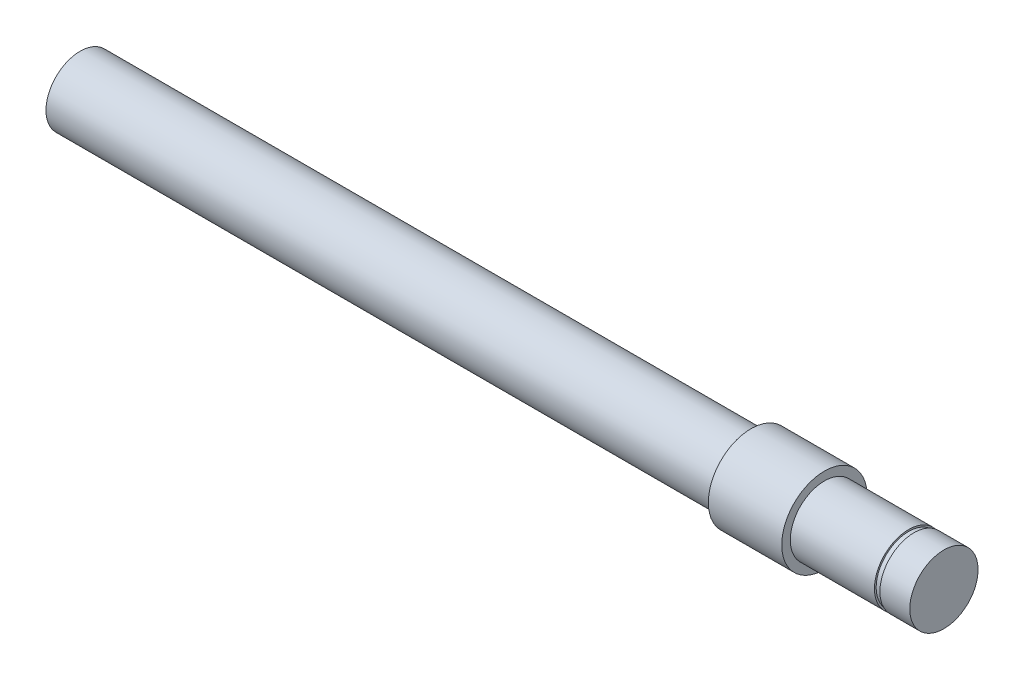
ISO-10303-21;
HEADER;
FILE_DESCRIPTION(('STEP AP214'),'2;1');
FILE_NAME('part.step','',(''),(''),'','','');
FILE_SCHEMA(('AUTOMOTIVE_DESIGN { 1 0 10303 214 1 1 1 1 }'));
ENDSEC;
DATA;
#1=APPLICATION_CONTEXT('core data for automotive mechanical design processes');
#2=APPLICATION_PROTOCOL_DEFINITION('international standard','automotive_design',2000,#1);
#3=PRODUCT_CONTEXT('',#1,'mechanical');
#4=PRODUCT('Part','Part','',(#3));
#5=PRODUCT_RELATED_PRODUCT_CATEGORY('part','',(#4));
#6=PRODUCT_DEFINITION_FORMATION('','',#4);
#7=PRODUCT_DEFINITION_CONTEXT('part definition',#1,'design');
#8=PRODUCT_DEFINITION('design','',#6,#7);
#9=PRODUCT_DEFINITION_SHAPE('','',#8);
#10=(LENGTH_UNIT() NAMED_UNIT(*) SI_UNIT(.MILLI.,.METRE.));
#11=(NAMED_UNIT(*) PLANE_ANGLE_UNIT() SI_UNIT($,.RADIAN.));
#12=(NAMED_UNIT(*) SI_UNIT($,.STERADIAN.) SOLID_ANGLE_UNIT());
#13=UNCERTAINTY_MEASURE_WITH_UNIT(LENGTH_MEASURE(1.E-05),#10,'distance_accuracy_value','');
#14=(GEOMETRIC_REPRESENTATION_CONTEXT(3) GLOBAL_UNCERTAINTY_ASSIGNED_CONTEXT((#13)) GLOBAL_UNIT_ASSIGNED_CONTEXT((#10,
#11,#12)) REPRESENTATION_CONTEXT('',''));
#15=CARTESIAN_POINT('',(0.,0.,0.));
#16=DIRECTION('',(0.,0.,1.));
#17=DIRECTION('',(1.,0.,0.));
#18=AXIS2_PLACEMENT_3D('',#15,#16,#17);
#19=CARTESIAN_POINT('',(27.299999999999,0.,0.));
#20=DIRECTION('',(1.,0.,0.));
#21=DIRECTION('',(0.,0.,-1.));
#22=AXIS2_PLACEMENT_3D('',#19,#20,#21);
#23=PLANE('',#22);
#24=CARTESIAN_POINT('',(27.299999999999,0.,0.));
#25=DIRECTION('',(-1.,0.,0.));
#26=DIRECTION('',(0.,0.,1.));
#27=AXIS2_PLACEMENT_3D('',#24,#25,#26);
#28=CIRCLE('',#27,2.);
#29=CARTESIAN_POINT('',(27.299999999999,0.,2.));
#30=VERTEX_POINT('',#29);
#31=EDGE_CURVE('E10',#30,#30,#28,.T.);
#32=ORIENTED_EDGE('',*,*,#31,.F.);
#33=EDGE_LOOP('',(#32));
#34=FACE_BOUND('',#33,.T.);
#35=CARTESIAN_POINT('',(27.299999999999,0.,0.));
#36=DIRECTION('',(-1.,0.,0.));
#37=DIRECTION('',(0.,0.,1.));
#38=AXIS2_PLACEMENT_3D('',#35,#36,#37);
#39=CIRCLE('',#38,2.5);
#40=CARTESIAN_POINT('',(27.299999999999,0.,2.5));
#41=VERTEX_POINT('',#40);
#42=EDGE_CURVE('E71',#41,#41,#39,.T.);
#43=ORIENTED_EDGE('',*,*,#42,.T.);
#44=EDGE_LOOP('',(#43));
#45=FACE_BOUND('',#44,.T.);
#46=ADVANCED_FACE('F37',(#34,#45),#23,.F.);
#47=CARTESIAN_POINT('',(0.,0.,0.));
#48=DIRECTION('',(-1.,0.,0.));
#49=DIRECTION('',(0.,0.,1.));
#50=AXIS2_PLACEMENT_3D('',#47,#48,#49);
#51=CYLINDRICAL_SURFACE('',#50,2.);
#52=CARTESIAN_POINT('',(-12.,0.,0.));
#53=DIRECTION('',(-1.,0.,0.));
#54=DIRECTION('',(0.,0.,1.));
#55=AXIS2_PLACEMENT_3D('',#52,#53,#54);
#56=CIRCLE('',#55,2.);
#57=CARTESIAN_POINT('',(-12.,0.,2.));
#58=VERTEX_POINT('',#57);
#59=EDGE_CURVE('E43',#58,#58,#56,.T.);
#60=ORIENTED_EDGE('',*,*,#59,.F.);
#61=EDGE_LOOP('',(#60));
#62=FACE_BOUND('',#61,.T.);
#63=ORIENTED_EDGE('',*,*,#31,.T.);
#64=EDGE_LOOP('',(#63));
#65=FACE_BOUND('',#64,.T.);
#66=ADVANCED_FACE('F125',(#62,#65),#51,.T.);
#67=CARTESIAN_POINT('',(-12.,0.,0.));
#68=DIRECTION('',(-1.,0.,0.));
#69=DIRECTION('',(0.,0.,1.));
#70=AXIS2_PLACEMENT_3D('',#67,#68,#69);
#71=PLANE('',#70);
#72=ORIENTED_EDGE('',*,*,#59,.T.);
#73=EDGE_LOOP('',(#72));
#74=FACE_BOUND('',#73,.T.);
#75=ADVANCED_FACE('F120',(#74),#71,.T.);
#76=CARTESIAN_POINT('',(38.599999999998,0.,0.));
#77=DIRECTION('',(-1.,0.,0.));
#78=DIRECTION('',(0.,0.,1.));
#79=AXIS2_PLACEMENT_3D('',#76,#77,#78);
#80=PLANE('',#79);
#81=CARTESIAN_POINT('',(38.599999999998,0.,0.));
#82=DIRECTION('',(-1.,0.,0.));
#83=DIRECTION('',(0.,0.,1.));
#84=AXIS2_PLACEMENT_3D('',#81,#82,#83);
#85=CIRCLE('',#84,2.);
#86=CARTESIAN_POINT('',(38.599999999998,0.,2.));
#87=VERTEX_POINT('',#86);
#88=EDGE_CURVE('E47',#87,#87,#85,.T.);
#89=ORIENTED_EDGE('',*,*,#88,.F.);
#90=EDGE_LOOP('',(#89));
#91=FACE_BOUND('',#90,.T.);
#92=ADVANCED_FACE('F115',(#91),#80,.F.);
#93=CARTESIAN_POINT('',(0.,0.,0.));
#94=DIRECTION('',(-1.,0.,0.));
#95=DIRECTION('',(0.,0.,1.));
#96=AXIS2_PLACEMENT_3D('',#93,#94,#95);
#97=CYLINDRICAL_SURFACE('',#96,2.);
#98=CARTESIAN_POINT('',(36.849999999999,0.,0.));
#99=DIRECTION('',(-1.,0.,0.));
#100=DIRECTION('',(0.,0.,1.));
#101=AXIS2_PLACEMENT_3D('',#98,#99,#100);
#102=CIRCLE('',#101,2.);
#103=CARTESIAN_POINT('',(36.849999999999,0.,2.));
#104=VERTEX_POINT('',#103);
#105=EDGE_CURVE('E51',#104,#104,#102,.T.);
#106=ORIENTED_EDGE('',*,*,#105,.F.);
#107=EDGE_LOOP('',(#106));
#108=FACE_BOUND('',#107,.T.);
#109=ORIENTED_EDGE('',*,*,#88,.T.);
#110=EDGE_LOOP('',(#109));
#111=FACE_BOUND('',#110,.T.);
#112=ADVANCED_FACE('F109',(#108,#111),#97,.T.);
#113=CARTESIAN_POINT('',(36.849999999999,0.,0.));
#114=DIRECTION('',(1.,0.,0.));
#115=DIRECTION('',(0.,0.,-1.));
#116=AXIS2_PLACEMENT_3D('',#113,#114,#115);
#117=PLANE('',#116);
#118=CARTESIAN_POINT('',(36.849999999999,0.,0.));
#119=DIRECTION('',(-1.,0.,0.));
#120=DIRECTION('',(0.,0.,1.));
#121=AXIS2_PLACEMENT_3D('',#118,#119,#120);
#122=CIRCLE('',#121,1.90000000000001);
#123=CARTESIAN_POINT('',(36.849999999999,0.,1.90000000000001));
#124=VERTEX_POINT('',#123);
#125=EDGE_CURVE('E56',#124,#124,#122,.T.);
#126=ORIENTED_EDGE('',*,*,#125,.F.);
#127=EDGE_LOOP('',(#126));
#128=FACE_BOUND('',#127,.T.);
#129=ORIENTED_EDGE('',*,*,#105,.T.);
#130=EDGE_LOOP('',(#129));
#131=FACE_BOUND('',#130,.T.);
#132=ADVANCED_FACE('F103',(#128,#131),#117,.F.);
#133=CARTESIAN_POINT('',(0.,0.,0.));
#134=DIRECTION('',(-1.,0.,0.));
#135=DIRECTION('',(0.,0.,1.));
#136=AXIS2_PLACEMENT_3D('',#133,#134,#135);
#137=CYLINDRICAL_SURFACE('',#136,1.90000000000001);
#138=CARTESIAN_POINT('',(36.529999999999,0.,0.));
#139=DIRECTION('',(-1.,0.,0.));
#140=DIRECTION('',(0.,0.,1.));
#141=AXIS2_PLACEMENT_3D('',#138,#139,#140);
#142=CIRCLE('',#141,1.90000000000001);
#143=CARTESIAN_POINT('',(36.529999999999,0.,1.90000000000001));
#144=VERTEX_POINT('',#143);
#145=EDGE_CURVE('E59',#144,#144,#142,.T.);
#146=ORIENTED_EDGE('',*,*,#145,.F.);
#147=EDGE_LOOP('',(#146));
#148=FACE_BOUND('',#147,.T.);
#149=ORIENTED_EDGE('',*,*,#125,.T.);
#150=EDGE_LOOP('',(#149));
#151=FACE_BOUND('',#150,.T.);
#152=ADVANCED_FACE('F97',(#148,#151),#137,.T.);
#153=CARTESIAN_POINT('',(36.529999999999,0.,0.));
#154=DIRECTION('',(-1.,0.,0.));
#155=DIRECTION('',(0.,0.,1.));
#156=AXIS2_PLACEMENT_3D('',#153,#154,#155);
#157=PLANE('',#156);
#158=CARTESIAN_POINT('',(36.529999999999,0.,0.));
#159=DIRECTION('',(-1.,0.,0.));
#160=DIRECTION('',(0.,0.,1.));
#161=AXIS2_PLACEMENT_3D('',#158,#159,#160);
#162=CIRCLE('',#161,2.);
#163=CARTESIAN_POINT('',(36.529999999999,0.,2.));
#164=VERTEX_POINT('',#163);
#165=EDGE_CURVE('E62',#164,#164,#162,.T.);
#166=ORIENTED_EDGE('',*,*,#165,.F.);
#167=EDGE_LOOP('',(#166));
#168=FACE_BOUND('',#167,.T.);
#169=ORIENTED_EDGE('',*,*,#145,.T.);
#170=EDGE_LOOP('',(#169));
#171=FACE_BOUND('',#170,.T.);
#172=ADVANCED_FACE('F91',(#168,#171),#157,.F.);
#173=CARTESIAN_POINT('',(0.,0.,0.));
#174=DIRECTION('',(-1.,0.,0.));
#175=DIRECTION('',(0.,0.,1.));
#176=AXIS2_PLACEMENT_3D('',#173,#174,#175);
#177=CYLINDRICAL_SURFACE('',#176,2.);
#178=CARTESIAN_POINT('',(31.599999999999,0.,0.));
#179=DIRECTION('',(-1.,0.,0.));
#180=DIRECTION('',(0.,0.,1.));
#181=AXIS2_PLACEMENT_3D('',#178,#179,#180);
#182=CIRCLE('',#181,2.);
#183=CARTESIAN_POINT('',(31.599999999999,0.,2.));
#184=VERTEX_POINT('',#183);
#185=EDGE_CURVE('E65',#184,#184,#182,.T.);
#186=ORIENTED_EDGE('',*,*,#185,.F.);
#187=EDGE_LOOP('',(#186));
#188=FACE_BOUND('',#187,.T.);
#189=ORIENTED_EDGE('',*,*,#165,.T.);
#190=EDGE_LOOP('',(#189));
#191=FACE_BOUND('',#190,.T.);
#192=ADVANCED_FACE('F85',(#188,#191),#177,.T.);
#193=CARTESIAN_POINT('',(31.599999999999,0.,0.));
#194=DIRECTION('',(-1.,0.,0.));
#195=DIRECTION('',(0.,0.,1.));
#196=AXIS2_PLACEMENT_3D('',#193,#194,#195);
#197=PLANE('',#196);
#198=CARTESIAN_POINT('',(31.599999999999,0.,0.));
#199=DIRECTION('',(-1.,0.,0.));
#200=DIRECTION('',(0.,0.,1.));
#201=AXIS2_PLACEMENT_3D('',#198,#199,#200);
#202=CIRCLE('',#201,2.5);
#203=CARTESIAN_POINT('',(31.599999999999,0.,2.5));
#204=VERTEX_POINT('',#203);
#205=EDGE_CURVE('E68',#204,#204,#202,.T.);
#206=ORIENTED_EDGE('',*,*,#205,.F.);
#207=EDGE_LOOP('',(#206));
#208=FACE_BOUND('',#207,.T.);
#209=ORIENTED_EDGE('',*,*,#185,.T.);
#210=EDGE_LOOP('',(#209));
#211=FACE_BOUND('',#210,.T.);
#212=ADVANCED_FACE('F79',(#208,#211),#197,.F.);
#213=CARTESIAN_POINT('',(0.,0.,0.));
#214=DIRECTION('',(-1.,0.,0.));
#215=DIRECTION('',(0.,0.,1.));
#216=AXIS2_PLACEMENT_3D('',#213,#214,#215);
#217=CYLINDRICAL_SURFACE('',#216,2.5);
#218=ORIENTED_EDGE('',*,*,#42,.F.);
#219=EDGE_LOOP('',(#218));
#220=FACE_BOUND('',#219,.T.);
#221=ORIENTED_EDGE('',*,*,#205,.T.);
#222=EDGE_LOOP('',(#221));
#223=FACE_BOUND('',#222,.T.);
#224=ADVANCED_FACE('F76',(#220,#223),#217,.T.);
#225=CLOSED_SHELL('',(#46,#66,#75,#92,#112,#132,#152,#172,#192,#212,#224));
#226=MANIFOLD_SOLID_BREP('B2',#225);
#227=ADVANCED_BREP_SHAPE_REPRESENTATION('',(#18,#226),#14);
#228=SHAPE_DEFINITION_REPRESENTATION(#9,#227);
ENDSEC;
END-ISO-10303-21;
